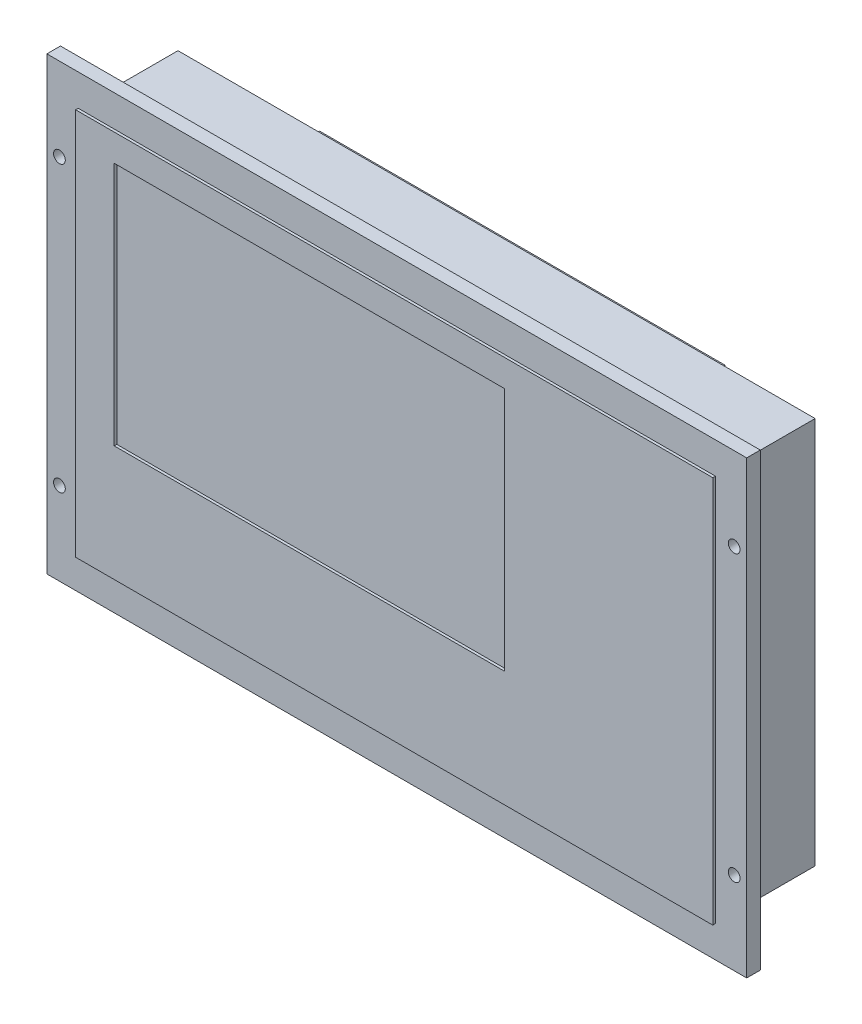
ISO-10303-21;
HEADER;
FILE_DESCRIPTION(('STEP AP214'),'2;1');
FILE_NAME('part.step','',(''),(''),'','','');
FILE_SCHEMA(('AUTOMOTIVE_DESIGN { 1 0 10303 214 1 1 1 1 }'));
ENDSEC;
DATA;
#1=APPLICATION_CONTEXT('core data for automotive mechanical design processes');
#2=APPLICATION_PROTOCOL_DEFINITION('international standard','automotive_design',2000,#1);
#3=PRODUCT_CONTEXT('',#1,'mechanical');
#4=PRODUCT('Part','Part','',(#3));
#5=PRODUCT_RELATED_PRODUCT_CATEGORY('part','',(#4));
#6=PRODUCT_DEFINITION_FORMATION('','',#4);
#7=PRODUCT_DEFINITION_CONTEXT('part definition',#1,'design');
#8=PRODUCT_DEFINITION('design','',#6,#7);
#9=PRODUCT_DEFINITION_SHAPE('','',#8);
#10=(LENGTH_UNIT() NAMED_UNIT(*) SI_UNIT(.MILLI.,.METRE.));
#11=(NAMED_UNIT(*) PLANE_ANGLE_UNIT() SI_UNIT($,.RADIAN.));
#12=(NAMED_UNIT(*) SI_UNIT($,.STERADIAN.) SOLID_ANGLE_UNIT());
#13=UNCERTAINTY_MEASURE_WITH_UNIT(LENGTH_MEASURE(1.E-05),#10,'distance_accuracy_value','');
#14=(GEOMETRIC_REPRESENTATION_CONTEXT(3) GLOBAL_UNCERTAINTY_ASSIGNED_CONTEXT((#13)) GLOBAL_UNIT_ASSIGNED_CONTEXT((#10,
#11,#12)) REPRESENTATION_CONTEXT('',''));
#15=CARTESIAN_POINT('',(0.,0.,0.));
#16=DIRECTION('',(0.,0.,1.));
#17=DIRECTION('',(1.,0.,0.));
#18=AXIS2_PLACEMENT_3D('',#15,#16,#17);
#19=CARTESIAN_POINT('',(0.,0.,-33.));
#20=DIRECTION('',(0.,0.,1.));
#21=DIRECTION('',(1.,0.,0.));
#22=AXIS2_PLACEMENT_3D('',#19,#20,#21);
#23=PLANE('',#22);
#24=DIRECTION('',(0.,-1.,0.));
#25=VECTOR('',#24,1.);
#26=CARTESIAN_POINT('',(77.5526008522653,64.6564848333083,-33.));
#27=LINE('',#26,#25);
#28=CARTESIAN_POINT('',(77.5526008522653,64.6564848333083,-33.));
#29=VERTEX_POINT('',#28);
#30=CARTESIAN_POINT('',(77.5526008522653,54.4537641503156,-33.));
#31=VERTEX_POINT('',#30);
#32=EDGE_CURVE('E246',#29,#31,#27,.T.);
#33=ORIENTED_EDGE('',*,*,#32,.F.);
#34=DIRECTION('',(1.,0.,0.));
#35=VECTOR('',#34,1.);
#36=CARTESIAN_POINT('',(77.5526008522653,64.6564848333083,-33.));
#37=LINE('',#36,#35);
#38=CARTESIAN_POINT('',(-77.732807942883,64.6564848333083,-33.));
#39=VERTEX_POINT('',#38);
#40=EDGE_CURVE('E259',#39,#29,#37,.T.);
#41=ORIENTED_EDGE('',*,*,#40,.F.);
#42=DIRECTION('',(0.,1.,0.));
#43=VECTOR('',#42,1.);
#44=CARTESIAN_POINT('',(-77.732807942883,64.6564848333083,-33.));
#45=LINE('',#44,#43);
#46=CARTESIAN_POINT('',(-77.732807942883,54.4537641503156,-33.));
#47=VERTEX_POINT('',#46);
#48=EDGE_CURVE('E268',#47,#39,#45,.T.);
#49=ORIENTED_EDGE('',*,*,#48,.F.);
#50=DIRECTION('',(-1.,0.,0.));
#51=VECTOR('',#50,1.);
#52=CARTESIAN_POINT('',(77.5526008522653,54.4537641503156,-33.));
#53=LINE('',#52,#51);
#54=EDGE_CURVE('E249',#31,#47,#53,.T.);
#55=ORIENTED_EDGE('',*,*,#54,.F.);
#56=EDGE_LOOP('',(#33,#41,#49,#55));
#57=FACE_BOUND('',#56,.T.);
#58=DIRECTION('',(0.,-1.,0.));
#59=VECTOR('',#58,1.);
#60=CARTESIAN_POINT('',(-122.,-74.2,-33.));
#61=LINE('',#60,#59);
#62=CARTESIAN_POINT('',(-122.,74.2,-33.));
#63=VERTEX_POINT('',#62);
#64=CARTESIAN_POINT('',(-122.,-74.2,-33.));
#65=VERTEX_POINT('',#64);
#66=EDGE_CURVE('E373',#63,#65,#61,.T.);
#67=ORIENTED_EDGE('',*,*,#66,.F.);
#68=DIRECTION('',(-1.,0.,0.));
#69=VECTOR('',#68,1.);
#70=CARTESIAN_POINT('',(122.,74.2,-33.));
#71=LINE('',#70,#69);
#72=CARTESIAN_POINT('',(122.,74.2,-33.));
#73=VERTEX_POINT('',#72);
#74=EDGE_CURVE('E382',#73,#63,#71,.T.);
#75=ORIENTED_EDGE('',*,*,#74,.F.);
#76=DIRECTION('',(0.,1.,0.));
#77=VECTOR('',#76,1.);
#78=CARTESIAN_POINT('',(122.,-74.2,-33.));
#79=LINE('',#78,#77);
#80=CARTESIAN_POINT('',(122.,-74.2,-33.));
#81=VERTEX_POINT('',#80);
#82=EDGE_CURVE('E379',#81,#73,#79,.T.);
#83=ORIENTED_EDGE('',*,*,#82,.F.);
#84=DIRECTION('',(1.,0.,0.));
#85=VECTOR('',#84,1.);
#86=CARTESIAN_POINT('',(122.,-74.2,-33.));
#87=LINE('',#86,#85);
#88=EDGE_CURVE('E376',#65,#81,#87,.T.);
#89=ORIENTED_EDGE('',*,*,#88,.F.);
#90=EDGE_LOOP('',(#67,#75,#83,#89));
#91=FACE_BOUND('',#90,.T.);
#92=DIRECTION('',(0.,-1.,0.));
#93=VECTOR('',#92,1.);
#94=CARTESIAN_POINT('',(103.671565800727,58.9429612508324,-33.));
#95=LINE('',#94,#93);
#96=CARTESIAN_POINT('',(103.671565800727,58.9429612508324,-33.));
#97=VERTEX_POINT('',#96);
#98=CARTESIAN_POINT('',(103.671565800727,-56.9599457079642,-33.));
#99=VERTEX_POINT('',#98);
#100=EDGE_CURVE('E284',#97,#99,#95,.T.);
#101=ORIENTED_EDGE('',*,*,#100,.F.);
#102=DIRECTION('',(1.,0.,0.));
#103=VECTOR('',#102,1.);
#104=CARTESIAN_POINT('',(103.671565800727,58.9429612508324,-33.));
#105=LINE('',#104,#103);
#106=CARTESIAN_POINT('',(93.4688451177339,58.9429612508324,-33.));
#107=VERTEX_POINT('',#106);
#108=EDGE_CURVE('E289',#107,#97,#105,.T.);
#109=ORIENTED_EDGE('',*,*,#108,.F.);
#110=DIRECTION('',(0.,1.,0.));
#111=VECTOR('',#110,1.);
#112=CARTESIAN_POINT('',(93.4688451177339,58.9429612508324,-33.));
#113=LINE('',#112,#111);
#114=CARTESIAN_POINT('',(93.4688451177339,-56.9599457079642,-33.));
#115=VERTEX_POINT('',#114);
#116=EDGE_CURVE('E301',#115,#107,#113,.T.);
#117=ORIENTED_EDGE('',*,*,#116,.F.);
#118=DIRECTION('',(-1.,0.,0.));
#119=VECTOR('',#118,1.);
#120=CARTESIAN_POINT('',(103.671565800727,-56.9599457079642,-33.));
#121=LINE('',#120,#119);
#122=EDGE_CURVE('E298',#99,#115,#121,.T.);
#123=ORIENTED_EDGE('',*,*,#122,.F.);
#124=EDGE_LOOP('',(#101,#109,#117,#123));
#125=FACE_BOUND('',#124,.T.);
#126=DIRECTION('',(0.,-1.,0.));
#127=VECTOR('',#126,1.);
#128=CARTESIAN_POINT('',(74.2877302337077,-48.5937147479102,-33.));
#129=LINE('',#128,#127);
#130=CARTESIAN_POINT('',(74.2877302337077,-48.5937147479102,-33.));
#131=VERTEX_POINT('',#130);
#132=CARTESIAN_POINT('',(74.2877302337077,-59.2045442582226,-33.));
#133=VERTEX_POINT('',#132);
#134=EDGE_CURVE('E245',#131,#133,#129,.T.);
#135=ORIENTED_EDGE('',*,*,#134,.F.);
#136=DIRECTION('',(1.,0.,0.));
#137=VECTOR('',#136,1.);
#138=CARTESIAN_POINT('',(74.2877302337077,-48.5937147479102,-33.));
#139=LINE('',#138,#137);
#140=CARTESIAN_POINT('',(-83.4463315253589,-48.5937147479102,-33.));
#141=VERTEX_POINT('',#140);
#142=EDGE_CURVE('E242',#141,#131,#139,.T.);
#143=ORIENTED_EDGE('',*,*,#142,.F.);
#144=DIRECTION('',(0.,1.,0.));
#145=VECTOR('',#144,1.);
#146=CARTESIAN_POINT('',(-83.4463315253589,-48.5937147479102,-33.));
#147=LINE('',#146,#145);
#148=CARTESIAN_POINT('',(-83.4463315253589,-59.2045442582226,-33.));
#149=VERTEX_POINT('',#148);
#150=EDGE_CURVE('E60',#149,#141,#147,.T.);
#151=ORIENTED_EDGE('',*,*,#150,.F.);
#152=DIRECTION('',(-1.,0.,0.));
#153=VECTOR('',#152,1.);
#154=CARTESIAN_POINT('',(74.2877302337077,-59.2045442582226,-33.));
#155=LINE('',#154,#153);
#156=EDGE_CURVE('E55',#133,#149,#155,.T.);
#157=ORIENTED_EDGE('',*,*,#156,.F.);
#158=EDGE_LOOP('',(#135,#143,#151,#157));
#159=FACE_BOUND('',#158,.T.);
#160=ADVANCED_FACE('F40',(#57,#91,#125,#159),#23,.F.);
#161=CARTESIAN_POINT('',(0.,0.,5.2));
#162=DIRECTION('',(0.,0.,-1.));
#163=DIRECTION('',(-1.,0.,0.));
#164=AXIS2_PLACEMENT_3D('',#161,#162,#163);
#165=PLANE('',#164);
#166=CARTESIAN_POINT('',(129.2,54.5,5.2));
#167=DIRECTION('',(0.,0.,-1.));
#168=DIRECTION('',(-1.,0.,0.));
#169=AXIS2_PLACEMENT_3D('',#166,#167,#168);
#170=CIRCLE('',#169,2.25);
#171=CARTESIAN_POINT('',(126.95,54.5,5.2));
#172=VERTEX_POINT('',#171);
#173=EDGE_CURVE('E352',#172,#172,#170,.T.);
#174=ORIENTED_EDGE('',*,*,#173,.T.);
#175=EDGE_LOOP('',(#174));
#176=FACE_BOUND('',#175,.T.);
#177=CARTESIAN_POINT('',(-129.2,-54.5,5.2));
#178=DIRECTION('',(0.,0.,-1.));
#179=DIRECTION('',(-1.,0.,0.));
#180=AXIS2_PLACEMENT_3D('',#177,#178,#179);
#181=CIRCLE('',#180,2.25);
#182=CARTESIAN_POINT('',(-131.45,-54.5,5.2));
#183=VERTEX_POINT('',#182);
#184=EDGE_CURVE('E358',#183,#183,#181,.T.);
#185=ORIENTED_EDGE('',*,*,#184,.T.);
#186=EDGE_LOOP('',(#185));
#187=FACE_BOUND('',#186,.T.);
#188=CARTESIAN_POINT('',(-129.2,54.5,5.2));
#189=DIRECTION('',(0.,0.,-1.));
#190=DIRECTION('',(-1.,0.,0.));
#191=AXIS2_PLACEMENT_3D('',#188,#189,#190);
#192=CIRCLE('',#191,2.25);
#193=CARTESIAN_POINT('',(-131.45,54.5,5.2));
#194=VERTEX_POINT('',#193);
#195=EDGE_CURVE('E364',#194,#194,#192,.T.);
#196=ORIENTED_EDGE('',*,*,#195,.T.);
#197=EDGE_LOOP('',(#196));
#198=FACE_BOUND('',#197,.T.);
#199=CARTESIAN_POINT('',(129.2,-54.5,5.2));
#200=DIRECTION('',(0.,0.,-1.));
#201=DIRECTION('',(-1.,0.,0.));
#202=AXIS2_PLACEMENT_3D('',#199,#200,#201);
#203=CIRCLE('',#202,2.25);
#204=CARTESIAN_POINT('',(126.95,-54.5,5.2));
#205=VERTEX_POINT('',#204);
#206=EDGE_CURVE('E370',#205,#205,#203,.T.);
#207=ORIENTED_EDGE('',*,*,#206,.T.);
#208=EDGE_LOOP('',(#207));
#209=FACE_BOUND('',#208,.T.);
#210=DIRECTION('',(0.,-1.,0.));
#211=VECTOR('',#210,1.);
#212=CARTESIAN_POINT('',(-134.,86.25,5.2));
#213=LINE('',#212,#211);
#214=CARTESIAN_POINT('',(-134.,86.25,5.2));
#215=VERTEX_POINT('',#214);
#216=CARTESIAN_POINT('',(-134.,-86.25,5.2));
#217=VERTEX_POINT('',#216);
#218=EDGE_CURVE('E426',#215,#217,#213,.T.);
#219=ORIENTED_EDGE('',*,*,#218,.T.);
#220=DIRECTION('',(1.,0.,0.));
#221=VECTOR('',#220,1.);
#222=CARTESIAN_POINT('',(134.,-86.25,5.2));
#223=LINE('',#222,#221);
#224=CARTESIAN_POINT('',(134.,-86.25,5.2));
#225=VERTEX_POINT('',#224);
#226=EDGE_CURVE('E429',#217,#225,#223,.T.);
#227=ORIENTED_EDGE('',*,*,#226,.T.);
#228=DIRECTION('',(0.,1.,0.));
#229=VECTOR('',#228,1.);
#230=CARTESIAN_POINT('',(134.,86.25,5.2));
#231=LINE('',#230,#229);
#232=CARTESIAN_POINT('',(134.,86.25,5.2));
#233=VERTEX_POINT('',#232);
#234=EDGE_CURVE('E432',#225,#233,#231,.T.);
#235=ORIENTED_EDGE('',*,*,#234,.T.);
#236=DIRECTION('',(-1.,0.,0.));
#237=VECTOR('',#236,1.);
#238=CARTESIAN_POINT('',(134.,86.25,5.2));
#239=LINE('',#238,#237);
#240=EDGE_CURVE('E434',#233,#215,#239,.T.);
#241=ORIENTED_EDGE('',*,*,#240,.T.);
#242=EDGE_LOOP('',(#219,#227,#235,#241));
#243=FACE_BOUND('',#242,.T.);
#244=DIRECTION('',(-1.,0.,0.));
#245=VECTOR('',#244,1.);
#246=CARTESIAN_POINT('',(0.,74.2,5.2));
#247=LINE('',#246,#245);
#248=CARTESIAN_POINT('',(122.,74.2,5.2));
#249=VERTEX_POINT('',#248);
#250=CARTESIAN_POINT('',(-122.,74.2,5.2));
#251=VERTEX_POINT('',#250);
#252=EDGE_CURVE('E422',#249,#251,#247,.T.);
#253=ORIENTED_EDGE('',*,*,#252,.F.);
#254=DIRECTION('',(0.,1.,0.));
#255=VECTOR('',#254,1.);
#256=CARTESIAN_POINT('',(122.,0.,5.2));
#257=LINE('',#256,#255);
#258=CARTESIAN_POINT('',(122.,-74.2,5.2));
#259=VERTEX_POINT('',#258);
#260=EDGE_CURVE('E419',#259,#249,#257,.T.);
#261=ORIENTED_EDGE('',*,*,#260,.F.);
#262=DIRECTION('',(1.,0.,0.));
#263=VECTOR('',#262,1.);
#264=CARTESIAN_POINT('',(0.,-74.2,5.2));
#265=LINE('',#264,#263);
#266=CARTESIAN_POINT('',(-122.,-74.2,5.19999999999998));
#267=VERTEX_POINT('',#266);
#268=EDGE_CURVE('E416',#267,#259,#265,.T.);
#269=ORIENTED_EDGE('',*,*,#268,.F.);
#270=DIRECTION('',(0.,-1.,0.));
#271=VECTOR('',#270,1.);
#272=CARTESIAN_POINT('',(-122.,0.,5.2));
#273=LINE('',#272,#271);
#274=EDGE_CURVE('E396',#251,#267,#273,.T.);
#275=ORIENTED_EDGE('',*,*,#274,.F.);
#276=EDGE_LOOP('',(#253,#261,#269,#275));
#277=FACE_BOUND('',#276,.T.);
#278=ADVANCED_FACE('F493',(#176,#187,#198,#209,#243,#277),#165,.F.);
#279=CARTESIAN_POINT('',(0.,0.,0.));
#280=DIRECTION('',(0.,0.,-1.));
#281=DIRECTION('',(-1.,0.,0.));
#282=AXIS2_PLACEMENT_3D('',#279,#280,#281);
#283=PLANE('',#282);
#284=CARTESIAN_POINT('',(129.2,54.5,0.));
#285=DIRECTION('',(0.,0.,-1.));
#286=DIRECTION('',(-1.,0.,0.));
#287=AXIS2_PLACEMENT_3D('',#284,#285,#286);
#288=CIRCLE('',#287,2.25);
#289=CARTESIAN_POINT('',(126.95,54.5,0.));
#290=VERTEX_POINT('',#289);
#291=EDGE_CURVE('E349',#290,#290,#288,.T.);
#292=ORIENTED_EDGE('',*,*,#291,.F.);
#293=EDGE_LOOP('',(#292));
#294=FACE_BOUND('',#293,.T.);
#295=CARTESIAN_POINT('',(-129.2,-54.5,0.));
#296=DIRECTION('',(0.,0.,-1.));
#297=DIRECTION('',(-1.,0.,0.));
#298=AXIS2_PLACEMENT_3D('',#295,#296,#297);
#299=CIRCLE('',#298,2.25);
#300=CARTESIAN_POINT('',(-131.45,-54.5,0.));
#301=VERTEX_POINT('',#300);
#302=EDGE_CURVE('E355',#301,#301,#299,.T.);
#303=ORIENTED_EDGE('',*,*,#302,.F.);
#304=EDGE_LOOP('',(#303));
#305=FACE_BOUND('',#304,.T.);
#306=CARTESIAN_POINT('',(-129.2,54.5,0.));
#307=DIRECTION('',(0.,0.,-1.));
#308=DIRECTION('',(-1.,0.,0.));
#309=AXIS2_PLACEMENT_3D('',#306,#307,#308);
#310=CIRCLE('',#309,2.25);
#311=CARTESIAN_POINT('',(-131.45,54.5,0.));
#312=VERTEX_POINT('',#311);
#313=EDGE_CURVE('E361',#312,#312,#310,.T.);
#314=ORIENTED_EDGE('',*,*,#313,.F.);
#315=EDGE_LOOP('',(#314));
#316=FACE_BOUND('',#315,.T.);
#317=CARTESIAN_POINT('',(129.2,-54.5,0.));
#318=DIRECTION('',(0.,0.,-1.));
#319=DIRECTION('',(-1.,0.,0.));
#320=AXIS2_PLACEMENT_3D('',#317,#318,#319);
#321=CIRCLE('',#320,2.25);
#322=CARTESIAN_POINT('',(126.95,-54.5,0.));
#323=VERTEX_POINT('',#322);
#324=EDGE_CURVE('E367',#323,#323,#321,.T.);
#325=ORIENTED_EDGE('',*,*,#324,.F.);
#326=EDGE_LOOP('',(#325));
#327=FACE_BOUND('',#326,.T.);
#328=DIRECTION('',(0.,-1.,0.));
#329=VECTOR('',#328,1.);
#330=CARTESIAN_POINT('',(-134.,86.25,0.));
#331=LINE('',#330,#329);
#332=CARTESIAN_POINT('',(-134.,86.25,0.));
#333=VERTEX_POINT('',#332);
#334=CARTESIAN_POINT('',(-134.,-86.25,0.));
#335=VERTEX_POINT('',#334);
#336=EDGE_CURVE('E425',#333,#335,#331,.T.);
#337=ORIENTED_EDGE('',*,*,#336,.F.);
#338=DIRECTION('',(-1.,0.,0.));
#339=VECTOR('',#338,1.);
#340=CARTESIAN_POINT('',(134.,86.25,0.));
#341=LINE('',#340,#339);
#342=CARTESIAN_POINT('',(134.,86.25,0.));
#343=VERTEX_POINT('',#342);
#344=EDGE_CURVE('E430',#343,#333,#341,.T.);
#345=ORIENTED_EDGE('',*,*,#344,.F.);
#346=DIRECTION('',(0.,1.,0.));
#347=VECTOR('',#346,1.);
#348=CARTESIAN_POINT('',(134.,86.25,0.));
#349=LINE('',#348,#347);
#350=CARTESIAN_POINT('',(134.,-86.25,0.));
#351=VERTEX_POINT('',#350);
#352=EDGE_CURVE('E441',#351,#343,#349,.T.);
#353=ORIENTED_EDGE('',*,*,#352,.F.);
#354=DIRECTION('',(1.,0.,0.));
#355=VECTOR('',#354,1.);
#356=CARTESIAN_POINT('',(134.,-86.25,0.));
#357=LINE('',#356,#355);
#358=EDGE_CURVE('E439',#335,#351,#357,.T.);
#359=ORIENTED_EDGE('',*,*,#358,.F.);
#360=EDGE_LOOP('',(#337,#345,#353,#359));
#361=FACE_BOUND('',#360,.T.);
#362=DIRECTION('',(0.,1.,0.));
#363=VECTOR('',#362,1.);
#364=CARTESIAN_POINT('',(122.,0.,0.));
#365=LINE('',#364,#363);
#366=CARTESIAN_POINT('',(122.,-74.2,0.));
#367=VERTEX_POINT('',#366);
#368=CARTESIAN_POINT('',(122.,74.2,0.));
#369=VERTEX_POINT('',#368);
#370=EDGE_CURVE('E48',#367,#369,#365,.T.);
#371=ORIENTED_EDGE('',*,*,#370,.T.);
#372=DIRECTION('',(-1.,0.,0.));
#373=VECTOR('',#372,1.);
#374=CARTESIAN_POINT('',(0.,74.2,0.));
#375=LINE('',#374,#373);
#376=CARTESIAN_POINT('',(-122.,74.2,0.));
#377=VERTEX_POINT('',#376);
#378=EDGE_CURVE('E12',#369,#377,#375,.T.);
#379=ORIENTED_EDGE('',*,*,#378,.T.);
#380=DIRECTION('',(0.,-1.,0.));
#381=VECTOR('',#380,1.);
#382=CARTESIAN_POINT('',(-122.,0.,0.));
#383=LINE('',#382,#381);
#384=CARTESIAN_POINT('',(-122.,-74.2,0.));
#385=VERTEX_POINT('',#384);
#386=EDGE_CURVE('E455',#377,#385,#383,.T.);
#387=ORIENTED_EDGE('',*,*,#386,.T.);
#388=DIRECTION('',(1.,0.,0.));
#389=VECTOR('',#388,1.);
#390=CARTESIAN_POINT('',(0.,-74.2,0.));
#391=LINE('',#390,#389);
#392=EDGE_CURVE('E458',#385,#367,#391,.T.);
#393=ORIENTED_EDGE('',*,*,#392,.T.);
#394=EDGE_LOOP('',(#371,#379,#387,#393));
#395=FACE_BOUND('',#394,.T.);
#396=ADVANCED_FACE('F462',(#294,#305,#316,#327,#361,#395),#283,.T.);
#397=CARTESIAN_POINT('',(-134.,86.25,5.2));
#398=DIRECTION('',(1.,0.,0.));
#399=DIRECTION('',(0.,1.,0.));
#400=AXIS2_PLACEMENT_3D('',#397,#398,#399);
#401=PLANE('',#400);
#402=ORIENTED_EDGE('',*,*,#336,.T.);
#403=DIRECTION('',(0.,0.,-1.));
#404=VECTOR('',#403,1.);
#405=CARTESIAN_POINT('',(-134.,-86.25,5.2));
#406=LINE('',#405,#404);
#407=EDGE_CURVE('E452',#217,#335,#406,.T.);
#408=ORIENTED_EDGE('',*,*,#407,.F.);
#409=ORIENTED_EDGE('',*,*,#218,.F.);
#410=DIRECTION('',(0.,0.,-1.));
#411=VECTOR('',#410,1.);
#412=CARTESIAN_POINT('',(-134.,86.25,5.2));
#413=LINE('',#412,#411);
#414=EDGE_CURVE('E436',#215,#333,#413,.T.);
#415=ORIENTED_EDGE('',*,*,#414,.T.);
#416=EDGE_LOOP('',(#402,#408,#409,#415));
#417=FACE_BOUND('',#416,.T.);
#418=ADVANCED_FACE('F42',(#417),#401,.F.);
#419=CARTESIAN_POINT('',(134.,-86.25,5.2));
#420=DIRECTION('',(0.,1.,0.));
#421=DIRECTION('',(-1.,0.,0.));
#422=AXIS2_PLACEMENT_3D('',#419,#420,#421);
#423=PLANE('',#422);
#424=ORIENTED_EDGE('',*,*,#358,.T.);
#425=DIRECTION('',(0.,0.,-1.));
#426=VECTOR('',#425,1.);
#427=CARTESIAN_POINT('',(134.,-86.25,5.2));
#428=LINE('',#427,#426);
#429=EDGE_CURVE('E449',#225,#351,#428,.T.);
#430=ORIENTED_EDGE('',*,*,#429,.F.);
#431=ORIENTED_EDGE('',*,*,#226,.F.);
#432=ORIENTED_EDGE('',*,*,#407,.T.);
#433=EDGE_LOOP('',(#424,#430,#431,#432));
#434=FACE_BOUND('',#433,.T.);
#435=ADVANCED_FACE('F545',(#434),#423,.F.);
#436=CARTESIAN_POINT('',(134.,86.25,5.2));
#437=DIRECTION('',(-1.,0.,0.));
#438=DIRECTION('',(0.,0.,1.));
#439=AXIS2_PLACEMENT_3D('',#436,#437,#438);
#440=PLANE('',#439);
#441=ORIENTED_EDGE('',*,*,#352,.T.);
#442=DIRECTION('',(0.,0.,-1.));
#443=VECTOR('',#442,1.);
#444=CARTESIAN_POINT('',(134.,86.25,5.2));
#445=LINE('',#444,#443);
#446=EDGE_CURVE('E446',#233,#343,#445,.T.);
#447=ORIENTED_EDGE('',*,*,#446,.F.);
#448=ORIENTED_EDGE('',*,*,#234,.F.);
#449=ORIENTED_EDGE('',*,*,#429,.T.);
#450=EDGE_LOOP('',(#441,#447,#448,#449));
#451=FACE_BOUND('',#450,.T.);
#452=ADVANCED_FACE('F542',(#451),#440,.F.);
#453=CARTESIAN_POINT('',(134.,86.25,5.2));
#454=DIRECTION('',(0.,-1.,0.));
#455=DIRECTION('',(1.,0.,0.));
#456=AXIS2_PLACEMENT_3D('',#453,#454,#455);
#457=PLANE('',#456);
#458=ORIENTED_EDGE('',*,*,#344,.T.);
#459=ORIENTED_EDGE('',*,*,#414,.F.);
#460=ORIENTED_EDGE('',*,*,#240,.F.);
#461=ORIENTED_EDGE('',*,*,#446,.T.);
#462=EDGE_LOOP('',(#458,#459,#460,#461));
#463=FACE_BOUND('',#462,.T.);
#464=ADVANCED_FACE('F535',(#463),#457,.F.);
#465=CARTESIAN_POINT('',(-122.,-74.2,292.784593421984));
#466=DIRECTION('',(1.,0.,0.));
#467=DIRECTION('',(0.,0.,-1.));
#468=AXIS2_PLACEMENT_3D('',#465,#466,#467);
#469=PLANE('',#468);
#470=ORIENTED_EDGE('',*,*,#386,.F.);
#471=DIRECTION('',(0.,0.,-1.));
#472=VECTOR('',#471,1.);
#473=CARTESIAN_POINT('',(-122.,74.2,292.784593421984));
#474=LINE('',#473,#472);
#475=EDGE_CURVE('E385',#377,#63,#474,.T.);
#476=ORIENTED_EDGE('',*,*,#475,.T.);
#477=ORIENTED_EDGE('',*,*,#66,.T.);
#478=DIRECTION('',(0.,0.,-1.));
#479=VECTOR('',#478,1.);
#480=CARTESIAN_POINT('',(-122.,-74.2,292.784593421984));
#481=LINE('',#480,#479);
#482=EDGE_CURVE('E408',#385,#65,#481,.T.);
#483=ORIENTED_EDGE('',*,*,#482,.F.);
#484=EDGE_LOOP('',(#470,#476,#477,#483));
#485=FACE_BOUND('',#484,.T.);
#486=ADVANCED_FACE('F477',(#485),#469,.F.);
#487=CARTESIAN_POINT('',(122.,-74.2,292.784593421984));
#488=DIRECTION('',(0.,1.,0.));
#489=DIRECTION('',(-1.,0.,0.));
#490=AXIS2_PLACEMENT_3D('',#487,#488,#489);
#491=PLANE('',#490);
#492=ORIENTED_EDGE('',*,*,#392,.F.);
#493=ORIENTED_EDGE('',*,*,#482,.T.);
#494=ORIENTED_EDGE('',*,*,#88,.T.);
#495=DIRECTION('',(0.,0.,-1.));
#496=VECTOR('',#495,1.);
#497=CARTESIAN_POINT('',(122.,-74.2,292.784593421984));
#498=LINE('',#497,#496);
#499=EDGE_CURVE('E404',#367,#81,#498,.T.);
#500=ORIENTED_EDGE('',*,*,#499,.F.);
#501=EDGE_LOOP('',(#492,#493,#494,#500));
#502=FACE_BOUND('',#501,.T.);
#503=ADVANCED_FACE('F470',(#502),#491,.F.);
#504=CARTESIAN_POINT('',(122.,-74.2,292.784593421984));
#505=DIRECTION('',(-1.,0.,0.));
#506=DIRECTION('',(0.,0.,1.));
#507=AXIS2_PLACEMENT_3D('',#504,#505,#506);
#508=PLANE('',#507);
#509=ORIENTED_EDGE('',*,*,#370,.F.);
#510=ORIENTED_EDGE('',*,*,#499,.T.);
#511=ORIENTED_EDGE('',*,*,#82,.T.);
#512=DIRECTION('',(0.,0.,-1.));
#513=VECTOR('',#512,1.);
#514=CARTESIAN_POINT('',(122.,74.2,292.784593421984));
#515=LINE('',#514,#513);
#516=EDGE_CURVE('E400',#369,#73,#515,.T.);
#517=ORIENTED_EDGE('',*,*,#516,.F.);
#518=EDGE_LOOP('',(#509,#510,#511,#517));
#519=FACE_BOUND('',#518,.T.);
#520=ADVANCED_FACE('F467',(#519),#508,.F.);
#521=CARTESIAN_POINT('',(122.,74.2,292.784593421984));
#522=DIRECTION('',(0.,-1.,0.));
#523=DIRECTION('',(1.,0.,0.));
#524=AXIS2_PLACEMENT_3D('',#521,#522,#523);
#525=PLANE('',#524);
#526=ORIENTED_EDGE('',*,*,#378,.F.);
#527=ORIENTED_EDGE('',*,*,#516,.T.);
#528=ORIENTED_EDGE('',*,*,#74,.T.);
#529=ORIENTED_EDGE('',*,*,#475,.F.);
#530=EDGE_LOOP('',(#526,#527,#528,#529));
#531=FACE_BOUND('',#530,.T.);
#532=ADVANCED_FACE('F480',(#531),#525,.F.);
#533=CARTESIAN_POINT('',(122.,74.2,6.19999999999998));
#534=VERTEX_POINT('',#533);
#535=EDGE_CURVE('E401',#534,#249,#515,.T.);
#536=ORIENTED_EDGE('',*,*,#535,.T.);
#537=ORIENTED_EDGE('',*,*,#252,.T.);
#538=CARTESIAN_POINT('',(-122.,74.2,6.19999999999998));
#539=VERTEX_POINT('',#538);
#540=EDGE_CURVE('E397',#539,#251,#474,.T.);
#541=ORIENTED_EDGE('',*,*,#540,.F.);
#542=DIRECTION('',(1.,0.,0.));
#543=VECTOR('',#542,1.);
#544=CARTESIAN_POINT('',(122.,74.2,6.19999999999998));
#545=LINE('',#544,#543);
#546=EDGE_CURVE('E390',#539,#534,#545,.T.);
#547=ORIENTED_EDGE('',*,*,#546,.T.);
#548=EDGE_LOOP('',(#536,#537,#541,#547));
#549=FACE_BOUND('',#548,.T.);
#550=ADVANCED_FACE('F482',(#549),#525,.F.);
#551=CARTESIAN_POINT('',(122.,-74.2,6.19999999999998));
#552=VERTEX_POINT('',#551);
#553=EDGE_CURVE('E405',#552,#259,#498,.T.);
#554=ORIENTED_EDGE('',*,*,#553,.T.);
#555=ORIENTED_EDGE('',*,*,#260,.T.);
#556=ORIENTED_EDGE('',*,*,#535,.F.);
#557=DIRECTION('',(0.,-1.,0.));
#558=VECTOR('',#557,1.);
#559=CARTESIAN_POINT('',(122.,-74.2,6.19999999999998));
#560=LINE('',#559,#558);
#561=EDGE_CURVE('E386',#534,#552,#560,.T.);
#562=ORIENTED_EDGE('',*,*,#561,.T.);
#563=EDGE_LOOP('',(#554,#555,#556,#562));
#564=FACE_BOUND('',#563,.T.);
#565=ADVANCED_FACE('F488',(#564),#508,.F.);
#566=CARTESIAN_POINT('',(-122.,-74.2,6.19999999999998));
#567=VERTEX_POINT('',#566);
#568=EDGE_CURVE('E409',#567,#267,#481,.T.);
#569=ORIENTED_EDGE('',*,*,#568,.T.);
#570=ORIENTED_EDGE('',*,*,#268,.T.);
#571=ORIENTED_EDGE('',*,*,#553,.F.);
#572=DIRECTION('',(-1.,0.,0.));
#573=VECTOR('',#572,1.);
#574=CARTESIAN_POINT('',(122.,-74.2,6.19999999999998));
#575=LINE('',#574,#573);
#576=EDGE_CURVE('E389',#552,#567,#575,.T.);
#577=ORIENTED_EDGE('',*,*,#576,.T.);
#578=EDGE_LOOP('',(#569,#570,#571,#577));
#579=FACE_BOUND('',#578,.T.);
#580=ADVANCED_FACE('F514',(#579),#491,.F.);
#581=ORIENTED_EDGE('',*,*,#540,.T.);
#582=ORIENTED_EDGE('',*,*,#274,.T.);
#583=ORIENTED_EDGE('',*,*,#568,.F.);
#584=DIRECTION('',(0.,1.,0.));
#585=VECTOR('',#584,1.);
#586=CARTESIAN_POINT('',(-122.,-74.2,6.19999999999998));
#587=LINE('',#586,#585);
#588=EDGE_CURVE('E393',#567,#539,#587,.T.);
#589=ORIENTED_EDGE('',*,*,#588,.T.);
#590=EDGE_LOOP('',(#581,#582,#583,#589));
#591=FACE_BOUND('',#590,.T.);
#592=ADVANCED_FACE('F506',(#591),#469,.F.);
#593=CARTESIAN_POINT('',(0.,0.,6.2));
#594=DIRECTION('',(0.,0.,-1.));
#595=DIRECTION('',(-1.,0.,0.));
#596=AXIS2_PLACEMENT_3D('',#593,#594,#595);
#597=PLANE('',#596);
#598=DIRECTION('',(0.,1.,0.));
#599=VECTOR('',#598,1.);
#600=CARTESIAN_POINT('',(42.3406079213886,63.852368397578,6.2));
#601=LINE('',#600,#599);
#602=CARTESIAN_POINT('',(42.3406079213886,-29.8774451058185,6.2));
#603=VERTEX_POINT('',#602);
#604=CARTESIAN_POINT('',(42.3406079213886,63.852368397578,6.2));
#605=VERTEX_POINT('',#604);
#606=EDGE_CURVE('E321',#603,#605,#601,.T.);
#607=ORIENTED_EDGE('',*,*,#606,.F.);
#608=DIRECTION('',(1.,0.,0.));
#609=VECTOR('',#608,1.);
#610=CARTESIAN_POINT('',(-107.217345865452,-29.8774451058185,6.2));
#611=LINE('',#610,#609);
#612=CARTESIAN_POINT('',(-107.217345865452,-29.8774451058185,6.2));
#613=VERTEX_POINT('',#612);
#614=EDGE_CURVE('E324',#613,#603,#611,.T.);
#615=ORIENTED_EDGE('',*,*,#614,.F.);
#616=DIRECTION('',(0.,-1.,0.));
#617=VECTOR('',#616,1.);
#618=CARTESIAN_POINT('',(-107.217345865452,63.852368397578,6.2));
#619=LINE('',#618,#617);
#620=CARTESIAN_POINT('',(-107.217345865452,63.852368397578,6.2));
#621=VERTEX_POINT('',#620);
#622=EDGE_CURVE('E317',#621,#613,#619,.T.);
#623=ORIENTED_EDGE('',*,*,#622,.F.);
#624=DIRECTION('',(-1.,0.,0.));
#625=VECTOR('',#624,1.);
#626=CARTESIAN_POINT('',(-107.217345865452,63.852368397578,6.2));
#627=LINE('',#626,#625);
#628=EDGE_CURVE('E318',#605,#621,#627,.T.);
#629=ORIENTED_EDGE('',*,*,#628,.F.);
#630=EDGE_LOOP('',(#607,#615,#623,#629));
#631=FACE_BOUND('',#630,.T.);
#632=ORIENTED_EDGE('',*,*,#576,.F.);
#633=ORIENTED_EDGE('',*,*,#561,.F.);
#634=ORIENTED_EDGE('',*,*,#546,.F.);
#635=ORIENTED_EDGE('',*,*,#588,.F.);
#636=EDGE_LOOP('',(#632,#633,#634,#635));
#637=FACE_BOUND('',#636,.T.);
#638=ADVANCED_FACE('F504',(#631,#637),#597,.F.);
#639=CARTESIAN_POINT('',(129.2,-54.5,0.));
#640=DIRECTION('',(0.,0.,-1.));
#641=DIRECTION('',(-1.,0.,0.));
#642=AXIS2_PLACEMENT_3D('',#639,#640,#641);
#643=CYLINDRICAL_SURFACE('',#642,2.25);
#644=ORIENTED_EDGE('',*,*,#206,.F.);
#645=EDGE_LOOP('',(#644));
#646=FACE_BOUND('',#645,.T.);
#647=ORIENTED_EDGE('',*,*,#324,.T.);
#648=EDGE_LOOP('',(#647));
#649=FACE_BOUND('',#648,.T.);
#650=ADVANCED_FACE('F502',(#646,#649),#643,.F.);
#651=CARTESIAN_POINT('',(-129.2,54.5,0.));
#652=DIRECTION('',(0.,0.,-1.));
#653=DIRECTION('',(-1.,0.,0.));
#654=AXIS2_PLACEMENT_3D('',#651,#652,#653);
#655=CYLINDRICAL_SURFACE('',#654,2.25);
#656=ORIENTED_EDGE('',*,*,#195,.F.);
#657=EDGE_LOOP('',(#656));
#658=FACE_BOUND('',#657,.T.);
#659=ORIENTED_EDGE('',*,*,#313,.T.);
#660=EDGE_LOOP('',(#659));
#661=FACE_BOUND('',#660,.T.);
#662=ADVANCED_FACE('F512',(#658,#661),#655,.F.);
#663=CARTESIAN_POINT('',(-129.2,-54.5,0.));
#664=DIRECTION('',(0.,0.,-1.));
#665=DIRECTION('',(-1.,0.,0.));
#666=AXIS2_PLACEMENT_3D('',#663,#664,#665);
#667=CYLINDRICAL_SURFACE('',#666,2.25);
#668=ORIENTED_EDGE('',*,*,#184,.F.);
#669=EDGE_LOOP('',(#668));
#670=FACE_BOUND('',#669,.T.);
#671=ORIENTED_EDGE('',*,*,#302,.T.);
#672=EDGE_LOOP('',(#671));
#673=FACE_BOUND('',#672,.T.);
#674=ADVANCED_FACE('F661',(#670,#673),#667,.F.);
#675=CARTESIAN_POINT('',(129.2,54.5,0.));
#676=DIRECTION('',(0.,0.,-1.));
#677=DIRECTION('',(-1.,0.,0.));
#678=AXIS2_PLACEMENT_3D('',#675,#676,#677);
#679=CYLINDRICAL_SURFACE('',#678,2.25);
#680=ORIENTED_EDGE('',*,*,#173,.F.);
#681=EDGE_LOOP('',(#680));
#682=FACE_BOUND('',#681,.T.);
#683=ORIENTED_EDGE('',*,*,#291,.T.);
#684=EDGE_LOOP('',(#683));
#685=FACE_BOUND('',#684,.T.);
#686=ADVANCED_FACE('F669',(#682,#685),#679,.F.);
#687=CARTESIAN_POINT('',(0.,0.,5.2));
#688=DIRECTION('',(0.,0.,-1.));
#689=DIRECTION('',(-1.,0.,0.));
#690=AXIS2_PLACEMENT_3D('',#687,#688,#689);
#691=PLANE('',#690);
#692=DIRECTION('',(0.,-1.,0.));
#693=VECTOR('',#692,1.);
#694=CARTESIAN_POINT('',(-107.217345865452,63.852368397578,5.20000000000001));
#695=LINE('',#694,#693);
#696=CARTESIAN_POINT('',(-107.217345865452,63.852368397578,5.20000000000001));
#697=VERTEX_POINT('',#696);
#698=CARTESIAN_POINT('',(-107.217345865452,-29.8774451058185,5.20000000000001));
#699=VERTEX_POINT('',#698);
#700=EDGE_CURVE('E332',#697,#699,#695,.T.);
#701=ORIENTED_EDGE('',*,*,#700,.T.);
#702=DIRECTION('',(1.,0.,0.));
#703=VECTOR('',#702,1.);
#704=CARTESIAN_POINT('',(-107.217345865452,-29.8774451058185,5.20000000000001));
#705=LINE('',#704,#703);
#706=CARTESIAN_POINT('',(42.3406079213886,-29.8774451058185,5.19999999999995));
#707=VERTEX_POINT('',#706);
#708=EDGE_CURVE('E320',#699,#707,#705,.T.);
#709=ORIENTED_EDGE('',*,*,#708,.T.);
#710=DIRECTION('',(0.,1.,0.));
#711=VECTOR('',#710,1.);
#712=CARTESIAN_POINT('',(42.3406079213886,63.852368397578,5.20000000000001));
#713=LINE('',#712,#711);
#714=CARTESIAN_POINT('',(42.3406079213886,63.852368397578,5.20000000000001));
#715=VERTEX_POINT('',#714);
#716=EDGE_CURVE('E341',#707,#715,#713,.T.);
#717=ORIENTED_EDGE('',*,*,#716,.T.);
#718=DIRECTION('',(-1.,0.,0.));
#719=VECTOR('',#718,1.);
#720=CARTESIAN_POINT('',(-107.217345865452,63.852368397578,5.20000000000001));
#721=LINE('',#720,#719);
#722=EDGE_CURVE('E337',#715,#697,#721,.T.);
#723=ORIENTED_EDGE('',*,*,#722,.T.);
#724=EDGE_LOOP('',(#701,#709,#717,#723));
#725=FACE_BOUND('',#724,.T.);
#726=ADVANCED_FACE('F677',(#725),#691,.F.);
#727=CARTESIAN_POINT('',(-107.217345865452,-29.8774451058185,-171.301726564609));
#728=DIRECTION('',(0.,-1.,0.));
#729=DIRECTION('',(0.,0.,-1.));
#730=AXIS2_PLACEMENT_3D('',#727,#728,#729);
#731=PLANE('',#730);
#732=DIRECTION('',(0.,0.,1.));
#733=VECTOR('',#732,1.);
#734=CARTESIAN_POINT('',(-107.217345865452,-29.8774451058185,-171.301726564609));
#735=LINE('',#734,#733);
#736=EDGE_CURVE('E335',#699,#613,#735,.T.);
#737=ORIENTED_EDGE('',*,*,#736,.T.);
#738=ORIENTED_EDGE('',*,*,#614,.T.);
#739=DIRECTION('',(0.,0.,1.));
#740=VECTOR('',#739,1.);
#741=CARTESIAN_POINT('',(42.3406079213886,-29.8774451058185,-171.301726564609));
#742=LINE('',#741,#740);
#743=EDGE_CURVE('E331',#707,#603,#742,.T.);
#744=ORIENTED_EDGE('',*,*,#743,.F.);
#745=ORIENTED_EDGE('',*,*,#708,.F.);
#746=EDGE_LOOP('',(#737,#738,#744,#745));
#747=FACE_BOUND('',#746,.T.);
#748=ADVANCED_FACE('F685',(#747),#731,.F.);
#749=CARTESIAN_POINT('',(42.3406079213886,63.852368397578,-171.301726564609));
#750=DIRECTION('',(1.,0.,0.));
#751=DIRECTION('',(0.,0.,-1.));
#752=AXIS2_PLACEMENT_3D('',#749,#750,#751);
#753=PLANE('',#752);
#754=ORIENTED_EDGE('',*,*,#743,.T.);
#755=ORIENTED_EDGE('',*,*,#606,.T.);
#756=DIRECTION('',(0.,0.,1.));
#757=VECTOR('',#756,1.);
#758=CARTESIAN_POINT('',(42.3406079213886,63.852368397578,-171.301726564609));
#759=LINE('',#758,#757);
#760=EDGE_CURVE('E340',#715,#605,#759,.T.);
#761=ORIENTED_EDGE('',*,*,#760,.F.);
#762=ORIENTED_EDGE('',*,*,#716,.F.);
#763=EDGE_LOOP('',(#754,#755,#761,#762));
#764=FACE_BOUND('',#763,.T.);
#765=ADVANCED_FACE('F695',(#764),#753,.F.);
#766=CARTESIAN_POINT('',(-107.217345865452,63.852368397578,-171.301726564609));
#767=DIRECTION('',(0.,1.,0.));
#768=DIRECTION('',(0.,0.,1.));
#769=AXIS2_PLACEMENT_3D('',#766,#767,#768);
#770=PLANE('',#769);
#771=ORIENTED_EDGE('',*,*,#760,.T.);
#772=ORIENTED_EDGE('',*,*,#628,.T.);
#773=DIRECTION('',(0.,0.,1.));
#774=VECTOR('',#773,1.);
#775=CARTESIAN_POINT('',(-107.217345865452,63.852368397578,-171.301726564609));
#776=LINE('',#775,#774);
#777=EDGE_CURVE('E336',#697,#621,#776,.T.);
#778=ORIENTED_EDGE('',*,*,#777,.F.);
#779=ORIENTED_EDGE('',*,*,#722,.F.);
#780=EDGE_LOOP('',(#771,#772,#778,#779));
#781=FACE_BOUND('',#780,.T.);
#782=ADVANCED_FACE('F704',(#781),#770,.F.);
#783=CARTESIAN_POINT('',(-107.217345865452,63.852368397578,-171.301726564609));
#784=DIRECTION('',(-1.,0.,0.));
#785=DIRECTION('',(0.,0.,1.));
#786=AXIS2_PLACEMENT_3D('',#783,#784,#785);
#787=PLANE('',#786);
#788=ORIENTED_EDGE('',*,*,#777,.T.);
#789=ORIENTED_EDGE('',*,*,#622,.T.);
#790=ORIENTED_EDGE('',*,*,#736,.F.);
#791=ORIENTED_EDGE('',*,*,#700,.F.);
#792=EDGE_LOOP('',(#788,#789,#790,#791));
#793=FACE_BOUND('',#792,.T.);
#794=ADVANCED_FACE('F713',(#793),#787,.F.);
#795=CARTESIAN_POINT('',(103.671565800727,58.9429612508324,-43.));
#796=DIRECTION('',(-1.,0.,0.));
#797=DIRECTION('',(0.,0.,1.));
#798=AXIS2_PLACEMENT_3D('',#795,#796,#797);
#799=PLANE('',#798);
#800=ORIENTED_EDGE('',*,*,#100,.T.);
#801=DIRECTION('',(0.,0.,1.));
#802=VECTOR('',#801,1.);
#803=CARTESIAN_POINT('',(103.671565800727,-56.9599457079642,-43.));
#804=LINE('',#803,#802);
#805=CARTESIAN_POINT('',(103.671565800727,-56.9599457079642,-43.));
#806=VERTEX_POINT('',#805);
#807=EDGE_CURVE('E314',#806,#99,#804,.T.);
#808=ORIENTED_EDGE('',*,*,#807,.F.);
#809=DIRECTION('',(0.,-1.,0.));
#810=VECTOR('',#809,1.);
#811=CARTESIAN_POINT('',(103.671565800727,58.9429612508324,-43.));
#812=LINE('',#811,#810);
#813=CARTESIAN_POINT('',(103.671565800727,58.9429612508324,-43.));
#814=VERTEX_POINT('',#813);
#815=EDGE_CURVE('E285',#814,#806,#812,.T.);
#816=ORIENTED_EDGE('',*,*,#815,.F.);
#817=DIRECTION('',(0.,0.,1.));
#818=VECTOR('',#817,1.);
#819=CARTESIAN_POINT('',(103.671565800727,58.9429612508324,-43.));
#820=LINE('',#819,#818);
#821=EDGE_CURVE('E295',#814,#97,#820,.T.);
#822=ORIENTED_EDGE('',*,*,#821,.T.);
#823=EDGE_LOOP('',(#800,#808,#816,#822));
#824=FACE_BOUND('',#823,.T.);
#825=ADVANCED_FACE('F722',(#824),#799,.F.);
#826=CARTESIAN_POINT('',(103.671565800727,-56.9599457079642,-43.));
#827=DIRECTION('',(0.,1.,0.));
#828=DIRECTION('',(0.,0.,1.));
#829=AXIS2_PLACEMENT_3D('',#826,#827,#828);
#830=PLANE('',#829);
#831=ORIENTED_EDGE('',*,*,#122,.T.);
#832=DIRECTION('',(0.,0.,1.));
#833=VECTOR('',#832,1.);
#834=CARTESIAN_POINT('',(93.4688451177339,-56.9599457079642,-43.));
#835=LINE('',#834,#833);
#836=CARTESIAN_POINT('',(93.4688451177339,-56.9599457079642,-43.));
#837=VERTEX_POINT('',#836);
#838=EDGE_CURVE('E311',#837,#115,#835,.T.);
#839=ORIENTED_EDGE('',*,*,#838,.F.);
#840=DIRECTION('',(-1.,0.,0.));
#841=VECTOR('',#840,1.);
#842=CARTESIAN_POINT('',(103.671565800727,-56.9599457079642,-43.));
#843=LINE('',#842,#841);
#844=EDGE_CURVE('E288',#806,#837,#843,.T.);
#845=ORIENTED_EDGE('',*,*,#844,.F.);
#846=ORIENTED_EDGE('',*,*,#807,.T.);
#847=EDGE_LOOP('',(#831,#839,#845,#846));
#848=FACE_BOUND('',#847,.T.);
#849=ADVANCED_FACE('F735',(#848),#830,.F.);
#850=CARTESIAN_POINT('',(93.4688451177339,58.9429612508324,-43.));
#851=DIRECTION('',(1.,0.,0.));
#852=DIRECTION('',(0.,0.,-1.));
#853=AXIS2_PLACEMENT_3D('',#850,#851,#852);
#854=PLANE('',#853);
#855=ORIENTED_EDGE('',*,*,#116,.T.);
#856=DIRECTION('',(0.,0.,1.));
#857=VECTOR('',#856,1.);
#858=CARTESIAN_POINT('',(93.4688451177339,58.9429612508324,-43.));
#859=LINE('',#858,#857);
#860=CARTESIAN_POINT('',(93.4688451177339,58.9429612508324,-43.));
#861=VERTEX_POINT('',#860);
#862=EDGE_CURVE('E308',#861,#107,#859,.T.);
#863=ORIENTED_EDGE('',*,*,#862,.F.);
#864=DIRECTION('',(0.,1.,0.));
#865=VECTOR('',#864,1.);
#866=CARTESIAN_POINT('',(93.4688451177339,58.9429612508324,-43.));
#867=LINE('',#866,#865);
#868=EDGE_CURVE('E291',#837,#861,#867,.T.);
#869=ORIENTED_EDGE('',*,*,#868,.F.);
#870=ORIENTED_EDGE('',*,*,#838,.T.);
#871=EDGE_LOOP('',(#855,#863,#869,#870));
#872=FACE_BOUND('',#871,.T.);
#873=ADVANCED_FACE('F744',(#872),#854,.F.);
#874=CARTESIAN_POINT('',(103.671565800727,58.9429612508324,-43.));
#875=DIRECTION('',(0.,-1.,0.));
#876=DIRECTION('',(0.,0.,-1.));
#877=AXIS2_PLACEMENT_3D('',#874,#875,#876);
#878=PLANE('',#877);
#879=ORIENTED_EDGE('',*,*,#108,.T.);
#880=ORIENTED_EDGE('',*,*,#821,.F.);
#881=DIRECTION('',(1.,0.,0.));
#882=VECTOR('',#881,1.);
#883=CARTESIAN_POINT('',(103.671565800727,58.9429612508324,-43.));
#884=LINE('',#883,#882);
#885=EDGE_CURVE('E293',#861,#814,#884,.T.);
#886=ORIENTED_EDGE('',*,*,#885,.F.);
#887=ORIENTED_EDGE('',*,*,#862,.T.);
#888=EDGE_LOOP('',(#879,#880,#886,#887));
#889=FACE_BOUND('',#888,.T.);
#890=ADVANCED_FACE('F753',(#889),#878,.F.);
#891=CARTESIAN_POINT('',(0.,0.,-43.));
#892=DIRECTION('',(0.,0.,-1.));
#893=DIRECTION('',(-1.,0.,0.));
#894=AXIS2_PLACEMENT_3D('',#891,#892,#893);
#895=PLANE('',#894);
#896=ORIENTED_EDGE('',*,*,#815,.T.);
#897=ORIENTED_EDGE('',*,*,#844,.T.);
#898=ORIENTED_EDGE('',*,*,#868,.T.);
#899=ORIENTED_EDGE('',*,*,#885,.T.);
#900=EDGE_LOOP('',(#896,#897,#898,#899));
#901=FACE_BOUND('',#900,.T.);
#902=ADVANCED_FACE('F762',(#901),#895,.T.);
#903=CARTESIAN_POINT('',(77.5526008522653,64.6564848333083,-43.));
#904=DIRECTION('',(-1.,0.,0.));
#905=DIRECTION('',(0.,0.,1.));
#906=AXIS2_PLACEMENT_3D('',#903,#904,#905);
#907=PLANE('',#906);
#908=ORIENTED_EDGE('',*,*,#32,.T.);
#909=DIRECTION('',(0.,0.,1.));
#910=VECTOR('',#909,1.);
#911=CARTESIAN_POINT('',(77.5526008522653,54.4537641503156,-43.));
#912=LINE('',#911,#910);
#913=CARTESIAN_POINT('',(77.5526008522653,54.4537641503156,-43.));
#914=VERTEX_POINT('',#913);
#915=EDGE_CURVE('E281',#914,#31,#912,.T.);
#916=ORIENTED_EDGE('',*,*,#915,.F.);
#917=DIRECTION('',(0.,-1.,0.));
#918=VECTOR('',#917,1.);
#919=CARTESIAN_POINT('',(77.5526008522653,64.6564848333083,-43.));
#920=LINE('',#919,#918);
#921=CARTESIAN_POINT('',(77.5526008522653,64.6564848333083,-43.));
#922=VERTEX_POINT('',#921);
#923=EDGE_CURVE('E255',#922,#914,#920,.T.);
#924=ORIENTED_EDGE('',*,*,#923,.F.);
#925=DIRECTION('',(0.,0.,1.));
#926=VECTOR('',#925,1.);
#927=CARTESIAN_POINT('',(77.5526008522653,64.6564848333083,-43.));
#928=LINE('',#927,#926);
#929=EDGE_CURVE('E264',#922,#29,#928,.T.);
#930=ORIENTED_EDGE('',*,*,#929,.T.);
#931=EDGE_LOOP('',(#908,#916,#924,#930));
#932=FACE_BOUND('',#931,.T.);
#933=ADVANCED_FACE('F771',(#932),#907,.F.);
#934=CARTESIAN_POINT('',(77.5526008522653,54.4537641503156,-43.));
#935=DIRECTION('',(0.,1.,0.));
#936=DIRECTION('',(0.,0.,1.));
#937=AXIS2_PLACEMENT_3D('',#934,#935,#936);
#938=PLANE('',#937);
#939=ORIENTED_EDGE('',*,*,#54,.T.);
#940=DIRECTION('',(0.,0.,1.));
#941=VECTOR('',#940,1.);
#942=CARTESIAN_POINT('',(-77.732807942883,54.4537641503156,-43.));
#943=LINE('',#942,#941);
#944=CARTESIAN_POINT('',(-77.732807942883,54.4537641503156,-43.));
#945=VERTEX_POINT('',#944);
#946=EDGE_CURVE('E278',#945,#47,#943,.T.);
#947=ORIENTED_EDGE('',*,*,#946,.F.);
#948=DIRECTION('',(-1.,0.,0.));
#949=VECTOR('',#948,1.);
#950=CARTESIAN_POINT('',(77.5526008522653,54.4537641503156,-43.));
#951=LINE('',#950,#949);
#952=EDGE_CURVE('E258',#914,#945,#951,.T.);
#953=ORIENTED_EDGE('',*,*,#952,.F.);
#954=ORIENTED_EDGE('',*,*,#915,.T.);
#955=EDGE_LOOP('',(#939,#947,#953,#954));
#956=FACE_BOUND('',#955,.T.);
#957=ADVANCED_FACE('F780',(#956),#938,.F.);
#958=CARTESIAN_POINT('',(-77.732807942883,64.6564848333083,-43.));
#959=DIRECTION('',(1.,0.,0.));
#960=DIRECTION('',(0.,0.,-1.));
#961=AXIS2_PLACEMENT_3D('',#958,#959,#960);
#962=PLANE('',#961);
#963=ORIENTED_EDGE('',*,*,#48,.T.);
#964=DIRECTION('',(0.,0.,1.));
#965=VECTOR('',#964,1.);
#966=CARTESIAN_POINT('',(-77.732807942883,64.6564848333083,-43.));
#967=LINE('',#966,#965);
#968=CARTESIAN_POINT('',(-77.732807942883,64.6564848333083,-43.));
#969=VERTEX_POINT('',#968);
#970=EDGE_CURVE('E275',#969,#39,#967,.T.);
#971=ORIENTED_EDGE('',*,*,#970,.F.);
#972=DIRECTION('',(0.,1.,0.));
#973=VECTOR('',#972,1.);
#974=CARTESIAN_POINT('',(-77.732807942883,64.6564848333083,-43.));
#975=LINE('',#974,#973);
#976=EDGE_CURVE('E261',#945,#969,#975,.T.);
#977=ORIENTED_EDGE('',*,*,#976,.F.);
#978=ORIENTED_EDGE('',*,*,#946,.T.);
#979=EDGE_LOOP('',(#963,#971,#977,#978));
#980=FACE_BOUND('',#979,.T.);
#981=ADVANCED_FACE('F789',(#980),#962,.F.);
#982=CARTESIAN_POINT('',(77.5526008522653,64.6564848333083,-43.));
#983=DIRECTION('',(0.,-1.,0.));
#984=DIRECTION('',(0.,0.,-1.));
#985=AXIS2_PLACEMENT_3D('',#982,#983,#984);
#986=PLANE('',#985);
#987=ORIENTED_EDGE('',*,*,#40,.T.);
#988=ORIENTED_EDGE('',*,*,#929,.F.);
#989=DIRECTION('',(1.,0.,0.));
#990=VECTOR('',#989,1.);
#991=CARTESIAN_POINT('',(77.5526008522653,64.6564848333083,-43.));
#992=LINE('',#991,#990);
#993=EDGE_CURVE('E263',#969,#922,#992,.T.);
#994=ORIENTED_EDGE('',*,*,#993,.F.);
#995=ORIENTED_EDGE('',*,*,#970,.T.);
#996=EDGE_LOOP('',(#987,#988,#994,#995));
#997=FACE_BOUND('',#996,.T.);
#998=ADVANCED_FACE('F798',(#997),#986,.F.);
#999=CARTESIAN_POINT('',(0.,0.,-43.));
#1000=DIRECTION('',(0.,0.,-1.));
#1001=DIRECTION('',(-1.,0.,0.));
#1002=AXIS2_PLACEMENT_3D('',#999,#1000,#1001);
#1003=PLANE('',#1002);
#1004=ORIENTED_EDGE('',*,*,#923,.T.);
#1005=ORIENTED_EDGE('',*,*,#952,.T.);
#1006=ORIENTED_EDGE('',*,*,#976,.T.);
#1007=ORIENTED_EDGE('',*,*,#993,.T.);
#1008=EDGE_LOOP('',(#1004,#1005,#1006,#1007));
#1009=FACE_BOUND('',#1008,.T.);
#1010=ADVANCED_FACE('F807',(#1009),#1003,.T.);
#1011=CARTESIAN_POINT('',(74.2877302337077,-48.5937147479102,-43.));
#1012=DIRECTION('',(-1.,0.,0.));
#1013=DIRECTION('',(0.,0.,1.));
#1014=AXIS2_PLACEMENT_3D('',#1011,#1012,#1013);
#1015=PLANE('',#1014);
#1016=ORIENTED_EDGE('',*,*,#134,.T.);
#1017=DIRECTION('',(0.,0.,1.));
#1018=VECTOR('',#1017,1.);
#1019=CARTESIAN_POINT('',(74.2877302337077,-59.2045442582226,-43.));
#1020=LINE('',#1019,#1018);
#1021=CARTESIAN_POINT('',(74.2877302337077,-59.2045442582226,-43.));
#1022=VERTEX_POINT('',#1021);
#1023=EDGE_CURVE('E226',#1022,#133,#1020,.T.);
#1024=ORIENTED_EDGE('',*,*,#1023,.F.);
#1025=DIRECTION('',(0.,-1.,0.));
#1026=VECTOR('',#1025,1.);
#1027=CARTESIAN_POINT('',(74.2877302337077,-48.5937147479102,-43.));
#1028=LINE('',#1027,#1026);
#1029=CARTESIAN_POINT('',(74.2877302337077,-48.5937147479102,-43.));
#1030=VERTEX_POINT('',#1029);
#1031=EDGE_CURVE('E233',#1030,#1022,#1028,.T.);
#1032=ORIENTED_EDGE('',*,*,#1031,.F.);
#1033=DIRECTION('',(0.,0.,1.));
#1034=VECTOR('',#1033,1.);
#1035=CARTESIAN_POINT('',(74.2877302337077,-48.5937147479102,-43.));
#1036=LINE('',#1035,#1034);
#1037=EDGE_CURVE('E885',#1030,#131,#1036,.T.);
#1038=ORIENTED_EDGE('',*,*,#1037,.T.);
#1039=EDGE_LOOP('',(#1016,#1024,#1032,#1038));
#1040=FACE_BOUND('',#1039,.T.);
#1041=ADVANCED_FACE('F244',(#1040),#1015,.F.);
#1042=CARTESIAN_POINT('',(74.2877302337077,-59.2045442582226,-43.));
#1043=DIRECTION('',(0.,1.,0.));
#1044=DIRECTION('',(0.,0.,1.));
#1045=AXIS2_PLACEMENT_3D('',#1042,#1043,#1044);
#1046=PLANE('',#1045);
#1047=ORIENTED_EDGE('',*,*,#156,.T.);
#1048=DIRECTION('',(0.,0.,1.));
#1049=VECTOR('',#1048,1.);
#1050=CARTESIAN_POINT('',(-83.4463315253589,-59.2045442582226,-43.));
#1051=LINE('',#1050,#1049);
#1052=CARTESIAN_POINT('',(-83.4463315253589,-59.2045442582226,-43.));
#1053=VERTEX_POINT('',#1052);
#1054=EDGE_CURVE('E229',#1053,#149,#1051,.T.);
#1055=ORIENTED_EDGE('',*,*,#1054,.F.);
#1056=DIRECTION('',(-1.,0.,0.));
#1057=VECTOR('',#1056,1.);
#1058=CARTESIAN_POINT('',(74.2877302337077,-59.2045442582226,-43.));
#1059=LINE('',#1058,#1057);
#1060=EDGE_CURVE('E222',#1022,#1053,#1059,.T.);
#1061=ORIENTED_EDGE('',*,*,#1060,.F.);
#1062=ORIENTED_EDGE('',*,*,#1023,.T.);
#1063=EDGE_LOOP('',(#1047,#1055,#1061,#1062));
#1064=FACE_BOUND('',#1063,.T.);
#1065=ADVANCED_FACE('F224',(#1064),#1046,.F.);
#1066=CARTESIAN_POINT('',(-83.4463315253589,-48.5937147479102,-43.));
#1067=DIRECTION('',(1.,0.,0.));
#1068=DIRECTION('',(0.,0.,-1.));
#1069=AXIS2_PLACEMENT_3D('',#1066,#1067,#1068);
#1070=PLANE('',#1069);
#1071=ORIENTED_EDGE('',*,*,#150,.T.);
#1072=DIRECTION('',(0.,0.,1.));
#1073=VECTOR('',#1072,1.);
#1074=CARTESIAN_POINT('',(-83.4463315253589,-48.5937147479102,-43.));
#1075=LINE('',#1074,#1073);
#1076=CARTESIAN_POINT('',(-83.4463315253589,-48.5937147479102,-43.));
#1077=VERTEX_POINT('',#1076);
#1078=EDGE_CURVE('E251',#1077,#141,#1075,.T.);
#1079=ORIENTED_EDGE('',*,*,#1078,.F.);
#1080=DIRECTION('',(0.,1.,0.));
#1081=VECTOR('',#1080,1.);
#1082=CARTESIAN_POINT('',(-83.4463315253589,-48.5937147479102,-43.));
#1083=LINE('',#1082,#1081);
#1084=EDGE_CURVE('E232',#1053,#1077,#1083,.T.);
#1085=ORIENTED_EDGE('',*,*,#1084,.F.);
#1086=ORIENTED_EDGE('',*,*,#1054,.T.);
#1087=EDGE_LOOP('',(#1071,#1079,#1085,#1086));
#1088=FACE_BOUND('',#1087,.T.);
#1089=ADVANCED_FACE('F831',(#1088),#1070,.F.);
#1090=CARTESIAN_POINT('',(74.2877302337077,-48.5937147479102,-43.));
#1091=DIRECTION('',(0.,-1.,0.));
#1092=DIRECTION('',(0.,0.,-1.));
#1093=AXIS2_PLACEMENT_3D('',#1090,#1091,#1092);
#1094=PLANE('',#1093);
#1095=ORIENTED_EDGE('',*,*,#142,.T.);
#1096=ORIENTED_EDGE('',*,*,#1037,.F.);
#1097=DIRECTION('',(1.,0.,0.));
#1098=VECTOR('',#1097,1.);
#1099=CARTESIAN_POINT('',(74.2877302337077,-48.5937147479102,-43.));
#1100=LINE('',#1099,#1098);
#1101=EDGE_CURVE('E238',#1077,#1030,#1100,.T.);
#1102=ORIENTED_EDGE('',*,*,#1101,.F.);
#1103=ORIENTED_EDGE('',*,*,#1078,.T.);
#1104=EDGE_LOOP('',(#1095,#1096,#1102,#1103));
#1105=FACE_BOUND('',#1104,.T.);
#1106=ADVANCED_FACE('F839',(#1105),#1094,.F.);
#1107=CARTESIAN_POINT('',(0.,0.,-43.));
#1108=DIRECTION('',(0.,0.,-1.));
#1109=DIRECTION('',(-1.,0.,0.));
#1110=AXIS2_PLACEMENT_3D('',#1107,#1108,#1109);
#1111=PLANE('',#1110);
#1112=ORIENTED_EDGE('',*,*,#1031,.T.);
#1113=ORIENTED_EDGE('',*,*,#1060,.T.);
#1114=ORIENTED_EDGE('',*,*,#1084,.T.);
#1115=ORIENTED_EDGE('',*,*,#1101,.T.);
#1116=EDGE_LOOP('',(#1112,#1113,#1114,#1115));
#1117=FACE_BOUND('',#1116,.T.);
#1118=ADVANCED_FACE('F236',(#1117),#1111,.T.);
#1119=CLOSED_SHELL('',(#160,#278,#396,#418,#435,#452,#464,#486,#503,#520,#532,#550,#565,#580,
#592,#638,#650,#662,#674,#686,#726,#748,#765,#782,#794,#825,#849,#873,#890,#902,#933,#957,#981,
#998,#1010,#1041,#1065,#1089,#1106,#1118));
#1120=MANIFOLD_SOLID_BREP('B2',#1119);
#1121=ADVANCED_BREP_SHAPE_REPRESENTATION('',(#18,#1120),#14);
#1122=SHAPE_DEFINITION_REPRESENTATION(#9,#1121);
ENDSEC;
END-ISO-10303-21;
